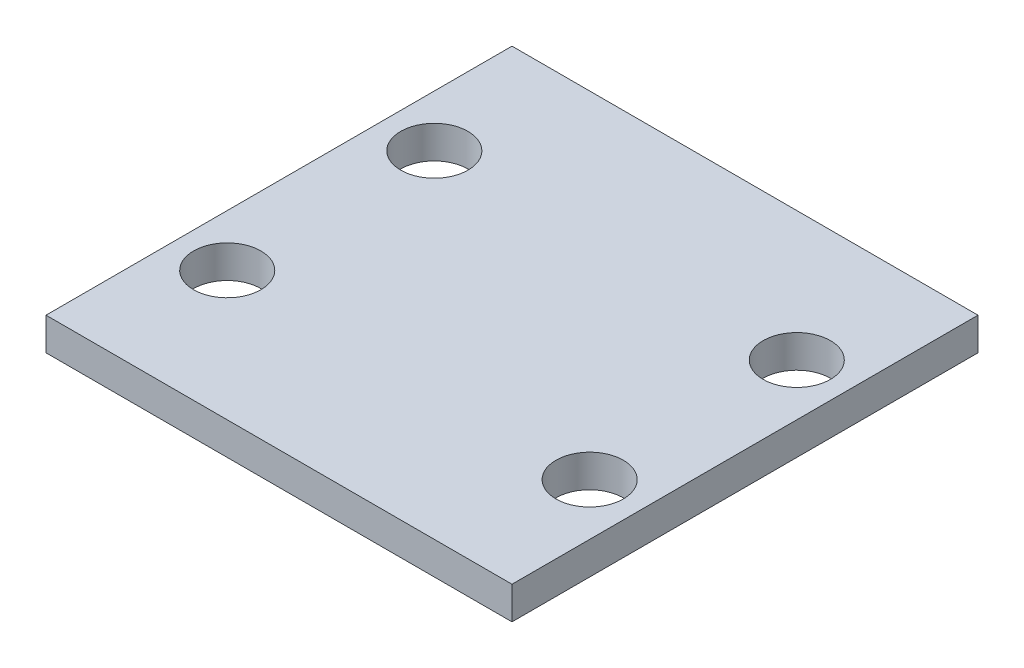
ISO-10303-21;
HEADER;
FILE_DESCRIPTION(('STEP AP214'),'2;1');
FILE_NAME('part.step','',(''),(''),'','','');
FILE_SCHEMA(('AUTOMOTIVE_DESIGN { 1 0 10303 214 1 1 1 1 }'));
ENDSEC;
DATA;
#1=APPLICATION_CONTEXT('core data for automotive mechanical design processes');
#2=APPLICATION_PROTOCOL_DEFINITION('international standard','automotive_design',2000,#1);
#3=PRODUCT_CONTEXT('',#1,'mechanical');
#4=PRODUCT('Part','Part','',(#3));
#5=PRODUCT_RELATED_PRODUCT_CATEGORY('part','',(#4));
#6=PRODUCT_DEFINITION_FORMATION('','',#4);
#7=PRODUCT_DEFINITION_CONTEXT('part definition',#1,'design');
#8=PRODUCT_DEFINITION('design','',#6,#7);
#9=PRODUCT_DEFINITION_SHAPE('','',#8);
#10=(LENGTH_UNIT() NAMED_UNIT(*) SI_UNIT(.MILLI.,.METRE.));
#11=(NAMED_UNIT(*) PLANE_ANGLE_UNIT() SI_UNIT($,.RADIAN.));
#12=(NAMED_UNIT(*) SI_UNIT($,.STERADIAN.) SOLID_ANGLE_UNIT());
#13=UNCERTAINTY_MEASURE_WITH_UNIT(LENGTH_MEASURE(1.E-05),#10,'distance_accuracy_value','');
#14=(GEOMETRIC_REPRESENTATION_CONTEXT(3) GLOBAL_UNCERTAINTY_ASSIGNED_CONTEXT((#13)) GLOBAL_UNIT_ASSIGNED_CONTEXT((#10,
#11,#12)) REPRESENTATION_CONTEXT('',''));
#15=CARTESIAN_POINT('',(0.,0.,0.));
#16=DIRECTION('',(0.,0.,1.));
#17=DIRECTION('',(1.,0.,0.));
#18=AXIS2_PLACEMENT_3D('',#15,#16,#17);
#19=CARTESIAN_POINT('',(0.,1.6,0.));
#20=DIRECTION('',(0.,-1.,0.));
#21=DIRECTION('',(0.,0.,-1.));
#22=AXIS2_PLACEMENT_3D('',#19,#20,#21);
#23=PLANE('',#22);
#24=DIRECTION('',(0.,0.,-1.));
#25=VECTOR('',#24,1.);
#26=CARTESIAN_POINT('',(11.43,1.6,11.43));
#27=LINE('',#26,#25);
#28=CARTESIAN_POINT('',(11.43,1.6,11.43));
#29=VERTEX_POINT('',#28);
#30=CARTESIAN_POINT('',(11.43,1.6,-11.43));
#31=VERTEX_POINT('',#30);
#32=EDGE_CURVE('E92',#29,#31,#27,.T.);
#33=ORIENTED_EDGE('',*,*,#32,.T.);
#34=DIRECTION('',(-1.,0.,0.));
#35=VECTOR('',#34,1.);
#36=CARTESIAN_POINT('',(-11.43,1.6,-11.43));
#37=LINE('',#36,#35);
#38=CARTESIAN_POINT('',(-11.43,1.6,-11.43));
#39=VERTEX_POINT('',#38);
#40=EDGE_CURVE('E87',#31,#39,#37,.T.);
#41=ORIENTED_EDGE('',*,*,#40,.T.);
#42=DIRECTION('',(0.,0.,1.));
#43=VECTOR('',#42,1.);
#44=CARTESIAN_POINT('',(-11.43,1.6,11.43));
#45=LINE('',#44,#43);
#46=CARTESIAN_POINT('',(-11.43,1.6,11.43));
#47=VERTEX_POINT('',#46);
#48=EDGE_CURVE('E90',#39,#47,#45,.T.);
#49=ORIENTED_EDGE('',*,*,#48,.T.);
#50=DIRECTION('',(1.,0.,0.));
#51=VECTOR('',#50,1.);
#52=CARTESIAN_POINT('',(-11.43,1.6,11.43));
#53=LINE('',#52,#51);
#54=EDGE_CURVE('E57',#47,#29,#53,.T.);
#55=ORIENTED_EDGE('',*,*,#54,.T.);
#56=EDGE_LOOP('',(#33,#41,#49,#55));
#57=FACE_BOUND('',#56,.T.);
#58=CARTESIAN_POINT('',(-8.89,1.6,-5.08));
#59=DIRECTION('',(0.,1.,0.));
#60=DIRECTION('',(0.,0.,1.));
#61=AXIS2_PLACEMENT_3D('',#58,#59,#60);
#62=CIRCLE('',#61,1.65);
#63=CARTESIAN_POINT('',(-8.89,1.6,-3.43));
#64=VERTEX_POINT('',#63);
#65=EDGE_CURVE('E112',#64,#64,#62,.T.);
#66=ORIENTED_EDGE('',*,*,#65,.F.);
#67=EDGE_LOOP('',(#66));
#68=FACE_BOUND('',#67,.T.);
#69=CARTESIAN_POINT('',(-8.89,1.6,5.08));
#70=DIRECTION('',(0.,1.,0.));
#71=DIRECTION('',(0.,0.,1.));
#72=AXIS2_PLACEMENT_3D('',#69,#70,#71);
#73=CIRCLE('',#72,1.65);
#74=CARTESIAN_POINT('',(-8.89,1.6,6.73));
#75=VERTEX_POINT('',#74);
#76=EDGE_CURVE('E134',#75,#75,#73,.T.);
#77=ORIENTED_EDGE('',*,*,#76,.F.);
#78=EDGE_LOOP('',(#77));
#79=FACE_BOUND('',#78,.T.);
#80=CARTESIAN_POINT('',(8.89,1.6,5.08));
#81=DIRECTION('',(0.,1.,0.));
#82=DIRECTION('',(0.,0.,1.));
#83=AXIS2_PLACEMENT_3D('',#80,#81,#82);
#84=CIRCLE('',#83,1.65);
#85=CARTESIAN_POINT('',(8.89,1.6,6.73));
#86=VERTEX_POINT('',#85);
#87=EDGE_CURVE('E142',#86,#86,#84,.T.);
#88=ORIENTED_EDGE('',*,*,#87,.F.);
#89=EDGE_LOOP('',(#88));
#90=FACE_BOUND('',#89,.T.);
#91=CARTESIAN_POINT('',(8.89,1.6,-5.08));
#92=DIRECTION('',(0.,1.,0.));
#93=DIRECTION('',(0.,0.,1.));
#94=AXIS2_PLACEMENT_3D('',#91,#92,#93);
#95=CIRCLE('',#94,1.65);
#96=CARTESIAN_POINT('',(8.89,1.6,-3.43));
#97=VERTEX_POINT('',#96);
#98=EDGE_CURVE('E150',#97,#97,#95,.T.);
#99=ORIENTED_EDGE('',*,*,#98,.F.);
#100=EDGE_LOOP('',(#99));
#101=FACE_BOUND('',#100,.T.);
#102=ADVANCED_FACE('F39',(#57,#68,#79,#90,#101),#23,.F.);
#103=CARTESIAN_POINT('',(0.,0.,0.));
#104=DIRECTION('',(0.,-1.,0.));
#105=DIRECTION('',(0.,0.,-1.));
#106=AXIS2_PLACEMENT_3D('',#103,#104,#105);
#107=PLANE('',#106);
#108=CARTESIAN_POINT('',(8.89,0.,5.08));
#109=DIRECTION('',(0.,1.,0.));
#110=DIRECTION('',(0.,0.,1.));
#111=AXIS2_PLACEMENT_3D('',#108,#109,#110);
#112=CIRCLE('',#111,1.65);
#113=CARTESIAN_POINT('',(8.89,0.,6.73));
#114=VERTEX_POINT('',#113);
#115=EDGE_CURVE('E146',#114,#114,#112,.T.);
#116=ORIENTED_EDGE('',*,*,#115,.T.);
#117=EDGE_LOOP('',(#116));
#118=FACE_BOUND('',#117,.T.);
#119=CARTESIAN_POINT('',(-8.89,0.,-5.08));
#120=DIRECTION('',(0.,1.,0.));
#121=DIRECTION('',(0.,0.,1.));
#122=AXIS2_PLACEMENT_3D('',#119,#120,#121);
#123=CIRCLE('',#122,1.65);
#124=CARTESIAN_POINT('',(-8.89,0.,-3.43));
#125=VERTEX_POINT('',#124);
#126=EDGE_CURVE('E130',#125,#125,#123,.T.);
#127=ORIENTED_EDGE('',*,*,#126,.T.);
#128=EDGE_LOOP('',(#127));
#129=FACE_BOUND('',#128,.T.);
#130=DIRECTION('',(0.,0.,-1.));
#131=VECTOR('',#130,1.);
#132=CARTESIAN_POINT('',(11.43,0.,11.43));
#133=LINE('',#132,#131);
#134=CARTESIAN_POINT('',(11.43,0.,11.43));
#135=VERTEX_POINT('',#134);
#136=CARTESIAN_POINT('',(11.43,0.,-11.43));
#137=VERTEX_POINT('',#136);
#138=EDGE_CURVE('E108',#135,#137,#133,.T.);
#139=ORIENTED_EDGE('',*,*,#138,.F.);
#140=DIRECTION('',(1.,0.,0.));
#141=VECTOR('',#140,1.);
#142=CARTESIAN_POINT('',(-11.43,0.,11.43));
#143=LINE('',#142,#141);
#144=CARTESIAN_POINT('',(-11.43,0.,11.43));
#145=VERTEX_POINT('',#144);
#146=EDGE_CURVE('E80',#145,#135,#143,.T.);
#147=ORIENTED_EDGE('',*,*,#146,.F.);
#148=DIRECTION('',(0.,0.,1.));
#149=VECTOR('',#148,1.);
#150=CARTESIAN_POINT('',(-11.43,0.,11.43));
#151=LINE('',#150,#149);
#152=CARTESIAN_POINT('',(-11.43,0.,-11.43));
#153=VERTEX_POINT('',#152);
#154=EDGE_CURVE('E74',#153,#145,#151,.T.);
#155=ORIENTED_EDGE('',*,*,#154,.F.);
#156=DIRECTION('',(-1.,0.,0.));
#157=VECTOR('',#156,1.);
#158=CARTESIAN_POINT('',(-11.43,0.,-11.43));
#159=LINE('',#158,#157);
#160=EDGE_CURVE('E97',#137,#153,#159,.T.);
#161=ORIENTED_EDGE('',*,*,#160,.F.);
#162=EDGE_LOOP('',(#139,#147,#155,#161));
#163=FACE_BOUND('',#162,.T.);
#164=CARTESIAN_POINT('',(-8.89,0.,5.08));
#165=DIRECTION('',(0.,1.,0.));
#166=DIRECTION('',(0.,0.,1.));
#167=AXIS2_PLACEMENT_3D('',#164,#165,#166);
#168=CIRCLE('',#167,1.65);
#169=CARTESIAN_POINT('',(-8.89,0.,6.73));
#170=VERTEX_POINT('',#169);
#171=EDGE_CURVE('E138',#170,#170,#168,.T.);
#172=ORIENTED_EDGE('',*,*,#171,.T.);
#173=EDGE_LOOP('',(#172));
#174=FACE_BOUND('',#173,.T.);
#175=CARTESIAN_POINT('',(8.89,0.,-5.08));
#176=DIRECTION('',(0.,1.,0.));
#177=DIRECTION('',(0.,0.,1.));
#178=AXIS2_PLACEMENT_3D('',#175,#176,#177);
#179=CIRCLE('',#178,1.65);
#180=CARTESIAN_POINT('',(8.89,0.,-3.43));
#181=VERTEX_POINT('',#180);
#182=EDGE_CURVE('E154',#181,#181,#179,.T.);
#183=ORIENTED_EDGE('',*,*,#182,.T.);
#184=EDGE_LOOP('',(#183));
#185=FACE_BOUND('',#184,.T.);
#186=ADVANCED_FACE('F125',(#118,#129,#163,#174,#185),#107,.T.);
#187=CARTESIAN_POINT('',(11.43,1.6,11.43));
#188=DIRECTION('',(-1.,0.,0.));
#189=DIRECTION('',(0.,0.,1.));
#190=AXIS2_PLACEMENT_3D('',#187,#188,#189);
#191=PLANE('',#190);
#192=ORIENTED_EDGE('',*,*,#138,.T.);
#193=DIRECTION('',(0.,-1.,0.));
#194=VECTOR('',#193,1.);
#195=CARTESIAN_POINT('',(11.43,1.6,-11.43));
#196=LINE('',#195,#194);
#197=EDGE_CURVE('E11',#31,#137,#196,.T.);
#198=ORIENTED_EDGE('',*,*,#197,.F.);
#199=ORIENTED_EDGE('',*,*,#32,.F.);
#200=DIRECTION('',(0.,-1.,0.));
#201=VECTOR('',#200,1.);
#202=CARTESIAN_POINT('',(11.43,1.6,11.43));
#203=LINE('',#202,#201);
#204=EDGE_CURVE('E104',#29,#135,#203,.T.);
#205=ORIENTED_EDGE('',*,*,#204,.T.);
#206=EDGE_LOOP('',(#192,#198,#199,#205));
#207=FACE_BOUND('',#206,.T.);
#208=ADVANCED_FACE('F41',(#207),#191,.F.);
#209=CARTESIAN_POINT('',(-11.43,1.6,-11.43));
#210=DIRECTION('',(0.,0.,1.));
#211=DIRECTION('',(1.,0.,0.));
#212=AXIS2_PLACEMENT_3D('',#209,#210,#211);
#213=PLANE('',#212);
#214=ORIENTED_EDGE('',*,*,#160,.T.);
#215=DIRECTION('',(0.,-1.,0.));
#216=VECTOR('',#215,1.);
#217=CARTESIAN_POINT('',(-11.43,1.6,-11.43));
#218=LINE('',#217,#216);
#219=EDGE_CURVE('E49',#39,#153,#218,.T.);
#220=ORIENTED_EDGE('',*,*,#219,.F.);
#221=ORIENTED_EDGE('',*,*,#40,.F.);
#222=ORIENTED_EDGE('',*,*,#197,.T.);
#223=EDGE_LOOP('',(#214,#220,#221,#222));
#224=FACE_BOUND('',#223,.T.);
#225=ADVANCED_FACE('F96',(#224),#213,.F.);
#226=CARTESIAN_POINT('',(-11.43,1.6,11.43));
#227=DIRECTION('',(1.,0.,0.));
#228=DIRECTION('',(0.,0.,-1.));
#229=AXIS2_PLACEMENT_3D('',#226,#227,#228);
#230=PLANE('',#229);
#231=ORIENTED_EDGE('',*,*,#154,.T.);
#232=DIRECTION('',(0.,-1.,0.));
#233=VECTOR('',#232,1.);
#234=CARTESIAN_POINT('',(-11.43,1.6,11.43));
#235=LINE('',#234,#233);
#236=EDGE_CURVE('E99',#47,#145,#235,.T.);
#237=ORIENTED_EDGE('',*,*,#236,.F.);
#238=ORIENTED_EDGE('',*,*,#48,.F.);
#239=ORIENTED_EDGE('',*,*,#219,.T.);
#240=EDGE_LOOP('',(#231,#237,#238,#239));
#241=FACE_BOUND('',#240,.T.);
#242=ADVANCED_FACE('F100',(#241),#230,.F.);
#243=CARTESIAN_POINT('',(-11.43,1.6,11.43));
#244=DIRECTION('',(0.,0.,-1.));
#245=DIRECTION('',(-1.,0.,0.));
#246=AXIS2_PLACEMENT_3D('',#243,#244,#245);
#247=PLANE('',#246);
#248=ORIENTED_EDGE('',*,*,#146,.T.);
#249=ORIENTED_EDGE('',*,*,#204,.F.);
#250=ORIENTED_EDGE('',*,*,#54,.F.);
#251=ORIENTED_EDGE('',*,*,#236,.T.);
#252=EDGE_LOOP('',(#248,#249,#250,#251));
#253=FACE_BOUND('',#252,.T.);
#254=ADVANCED_FACE('F122',(#253),#247,.F.);
#255=CARTESIAN_POINT('',(-8.89,1.6,-5.08));
#256=DIRECTION('',(0.,-1.,0.));
#257=DIRECTION('',(0.,0.,-1.));
#258=AXIS2_PLACEMENT_3D('',#255,#256,#257);
#259=CYLINDRICAL_SURFACE('',#258,1.65);
#260=ORIENTED_EDGE('',*,*,#65,.T.);
#261=EDGE_LOOP('',(#260));
#262=FACE_BOUND('',#261,.T.);
#263=ORIENTED_EDGE('',*,*,#126,.F.);
#264=EDGE_LOOP('',(#263));
#265=FACE_BOUND('',#264,.T.);
#266=ADVANCED_FACE('F173',(#262,#265),#259,.F.);
#267=CARTESIAN_POINT('',(-8.89,1.6,5.08));
#268=DIRECTION('',(0.,-1.,0.));
#269=DIRECTION('',(0.,0.,-1.));
#270=AXIS2_PLACEMENT_3D('',#267,#268,#269);
#271=CYLINDRICAL_SURFACE('',#270,1.65);
#272=ORIENTED_EDGE('',*,*,#76,.T.);
#273=EDGE_LOOP('',(#272));
#274=FACE_BOUND('',#273,.T.);
#275=ORIENTED_EDGE('',*,*,#171,.F.);
#276=EDGE_LOOP('',(#275));
#277=FACE_BOUND('',#276,.T.);
#278=ADVANCED_FACE('F219',(#274,#277),#271,.F.);
#279=CARTESIAN_POINT('',(8.89,1.6,5.08));
#280=DIRECTION('',(0.,-1.,0.));
#281=DIRECTION('',(0.,0.,-1.));
#282=AXIS2_PLACEMENT_3D('',#279,#280,#281);
#283=CYLINDRICAL_SURFACE('',#282,1.65);
#284=ORIENTED_EDGE('',*,*,#87,.T.);
#285=EDGE_LOOP('',(#284));
#286=FACE_BOUND('',#285,.T.);
#287=ORIENTED_EDGE('',*,*,#115,.F.);
#288=EDGE_LOOP('',(#287));
#289=FACE_BOUND('',#288,.T.);
#290=ADVANCED_FACE('F227',(#286,#289),#283,.F.);
#291=CARTESIAN_POINT('',(8.89,1.6,-5.08));
#292=DIRECTION('',(0.,-1.,0.));
#293=DIRECTION('',(0.,0.,-1.));
#294=AXIS2_PLACEMENT_3D('',#291,#292,#293);
#295=CYLINDRICAL_SURFACE('',#294,1.65);
#296=ORIENTED_EDGE('',*,*,#98,.T.);
#297=EDGE_LOOP('',(#296));
#298=FACE_BOUND('',#297,.T.);
#299=ORIENTED_EDGE('',*,*,#182,.F.);
#300=EDGE_LOOP('',(#299));
#301=FACE_BOUND('',#300,.T.);
#302=ADVANCED_FACE('F162',(#298,#301),#295,.F.);
#303=CLOSED_SHELL('',(#102,#186,#208,#225,#242,#254,#266,#278,#290,#302));
#304=MANIFOLD_SOLID_BREP('B2',#303);
#305=ADVANCED_BREP_SHAPE_REPRESENTATION('',(#18,#304),#14);
#306=SHAPE_DEFINITION_REPRESENTATION(#9,#305);
ENDSEC;
END-ISO-10303-21;
